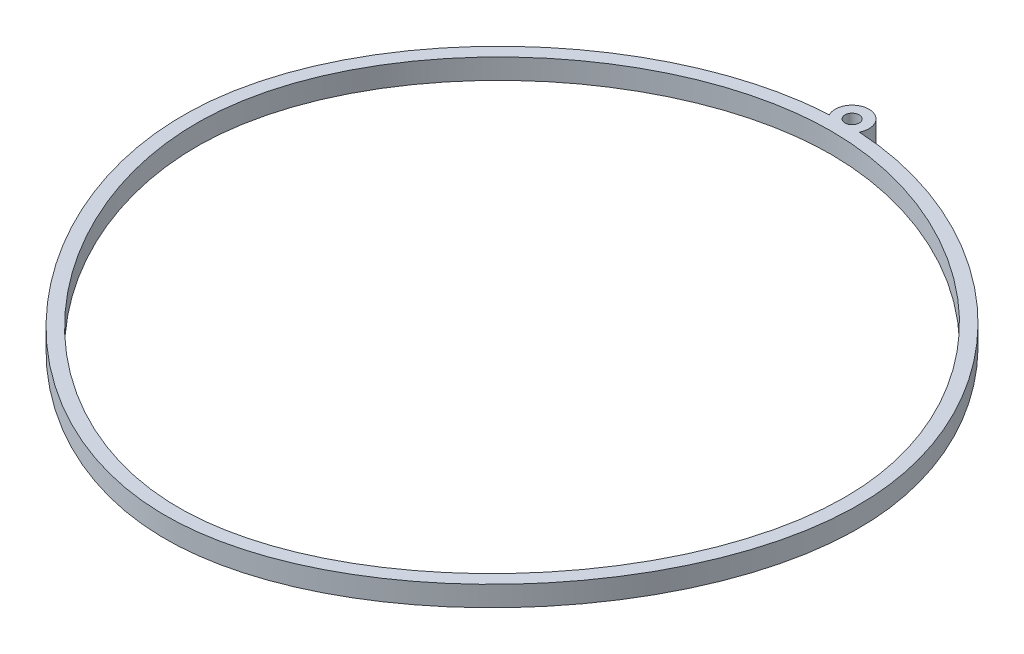
ISO-10303-21;
HEADER;
FILE_DESCRIPTION(('STEP AP214'),'2;1');
FILE_NAME('part.step','',(''),(''),'','','');
FILE_SCHEMA(('AUTOMOTIVE_DESIGN { 1 0 10303 214 1 1 1 1 }'));
ENDSEC;
DATA;
#1=APPLICATION_CONTEXT('core data for automotive mechanical design processes');
#2=APPLICATION_PROTOCOL_DEFINITION('international standard','automotive_design',2000,#1);
#3=PRODUCT_CONTEXT('',#1,'mechanical');
#4=PRODUCT('Part','Part','',(#3));
#5=PRODUCT_RELATED_PRODUCT_CATEGORY('part','',(#4));
#6=PRODUCT_DEFINITION_FORMATION('','',#4);
#7=PRODUCT_DEFINITION_CONTEXT('part definition',#1,'design');
#8=PRODUCT_DEFINITION('design','',#6,#7);
#9=PRODUCT_DEFINITION_SHAPE('','',#8);
#10=(LENGTH_UNIT() NAMED_UNIT(*) SI_UNIT(.MILLI.,.METRE.));
#11=(NAMED_UNIT(*) PLANE_ANGLE_UNIT() SI_UNIT($,.RADIAN.));
#12=(NAMED_UNIT(*) SI_UNIT($,.STERADIAN.) SOLID_ANGLE_UNIT());
#13=UNCERTAINTY_MEASURE_WITH_UNIT(LENGTH_MEASURE(1.E-05),#10,'distance_accuracy_value','');
#14=(GEOMETRIC_REPRESENTATION_CONTEXT(3) GLOBAL_UNCERTAINTY_ASSIGNED_CONTEXT((#13)) GLOBAL_UNIT_ASSIGNED_CONTEXT((#10,
#11,#12)) REPRESENTATION_CONTEXT('',''));
#15=CARTESIAN_POINT('',(0.,0.,0.));
#16=DIRECTION('',(0.,0.,1.));
#17=DIRECTION('',(1.,0.,0.));
#18=AXIS2_PLACEMENT_3D('',#15,#16,#17);
#19=CARTESIAN_POINT('',(0.,3.,-46.5304));
#20=DIRECTION('',(0.,-1.,0.));
#21=DIRECTION('',(0.,0.,-1.));
#22=AXIS2_PLACEMENT_3D('',#19,#20,#21);
#23=CYLINDRICAL_SURFACE('',#22,2.50000000000002);
#24=CARTESIAN_POINT('',(0.,0.,-46.5304));
#25=DIRECTION('',(0.,1.,0.));
#26=DIRECTION('',(0.,0.,1.));
#27=AXIS2_PLACEMENT_3D('',#24,#25,#26);
#28=CIRCLE('',#27,2.50000000000002);
#29=CARTESIAN_POINT('',(2.21457080166397,0.,-45.3703671709742));
#30=VERTEX_POINT('',#29);
#31=CARTESIAN_POINT('',(-2.21457080166396,0.,-45.3703671709742));
#32=VERTEX_POINT('',#31);
#33=EDGE_CURVE('E64',#30,#32,#28,.T.);
#34=ORIENTED_EDGE('',*,*,#33,.T.);
#35=DIRECTION('',(0.,-1.,0.));
#36=VECTOR('',#35,1.);
#37=CARTESIAN_POINT('',(-2.21457080166396,3.,-45.3703671709742));
#38=LINE('',#37,#36);
#39=CARTESIAN_POINT('',(-2.21457080166396,3.,-45.3703671709742));
#40=VERTEX_POINT('',#39);
#41=EDGE_CURVE('E11',#40,#32,#38,.T.);
#42=ORIENTED_EDGE('',*,*,#41,.F.);
#43=CARTESIAN_POINT('',(0.,3.,-46.5304));
#44=DIRECTION('',(0.,1.,0.));
#45=DIRECTION('',(0.,0.,1.));
#46=AXIS2_PLACEMENT_3D('',#43,#44,#45);
#47=CIRCLE('',#46,2.50000000000002);
#48=CARTESIAN_POINT('',(2.21457080166397,3.,-45.3703671709742));
#49=VERTEX_POINT('',#48);
#50=EDGE_CURVE('E66',#49,#40,#47,.T.);
#51=ORIENTED_EDGE('',*,*,#50,.F.);
#52=DIRECTION('',(0.,-1.,0.));
#53=VECTOR('',#52,1.);
#54=CARTESIAN_POINT('',(2.21457080166397,3.,-45.3703671709742));
#55=LINE('',#54,#53);
#56=EDGE_CURVE('E48',#49,#30,#55,.T.);
#57=ORIENTED_EDGE('',*,*,#56,.T.);
#58=EDGE_LOOP('',(#34,#42,#51,#57));
#59=FACE_BOUND('',#58,.T.);
#60=ADVANCED_FACE('F39',(#59),#23,.T.);
#61=CARTESIAN_POINT('',(0.,3.,-45.4304));
#62=CARTESIAN_POINT('',(24.1630686267008,3.,-45.4304));
#63=CARTESIAN_POINT('',(74.9408233980818,3.,0.0160415094266469));
#64=CARTESIAN_POINT('',(0.,3.,83.943698436738));
#65=CARTESIAN_POINT('',(-74.9408233980818,3.,0.0160415094266282));
#66=CARTESIAN_POINT('',(-24.1630686267008,3.,-45.4304));
#67=CARTESIAN_POINT('',(0.,3.,-45.4304));
#68=B_SPLINE_CURVE_WITH_KNOTS('',3,(#61,#62,#63,#64,#65,#66,#67),.UNSPECIFIED.,.T.,.F.,(4,1,1,1,
4),(0.,0.237929667582697,0.5,0.762070332417303,1.),.UNSPECIFIED.);
#69=DIRECTION('',(0.,-1.,0.));
#70=VECTOR('',#69,1.);
#71=SURFACE_OF_LINEAR_EXTRUSION('',#68,#70);
#72=CARTESIAN_POINT('',(0.,0.,-45.4304));
#73=CARTESIAN_POINT('',(24.1630686267008,0.,-45.4304));
#74=CARTESIAN_POINT('',(74.9408233980818,0.,0.0160415094266469));
#75=CARTESIAN_POINT('',(0.,0.,83.943698436738));
#76=CARTESIAN_POINT('',(-74.9408233980818,0.,0.0160415094266282));
#77=CARTESIAN_POINT('',(-24.1630686267008,0.,-45.4304));
#78=CARTESIAN_POINT('',(0.,0.,-45.4304));
#79=B_SPLINE_CURVE_WITH_KNOTS('',3,(#72,#73,#74,#75,#76,#77,#78),.UNSPECIFIED.,.T.,.F.,(4,1,1,1,
4),(0.,0.237929667582697,0.5,0.762070332417303,1.),.UNSPECIFIED.);
#80=EDGE_CURVE('E72',#30,#32,#79,.T.);
#81=ORIENTED_EDGE('',*,*,#80,.F.);
#82=ORIENTED_EDGE('',*,*,#56,.F.);
#83=EDGE_CURVE('E99',#49,#40,#68,.T.);
#84=ORIENTED_EDGE('',*,*,#83,.T.);
#85=ORIENTED_EDGE('',*,*,#41,.T.);
#86=EDGE_LOOP('',(#81,#82,#84,#85));
#87=FACE_BOUND('',#86,.T.);
#88=ADVANCED_FACE('F75',(#87),#71,.T.);
#89=CARTESIAN_POINT('',(0.,3.,-46.5304));
#90=DIRECTION('',(0.,-1.,0.));
#91=DIRECTION('',(0.,0.,-1.));
#92=AXIS2_PLACEMENT_3D('',#89,#90,#91);
#93=CYLINDRICAL_SURFACE('',#92,1.05);
#94=CARTESIAN_POINT('',(0.,3.,-46.5304));
#95=DIRECTION('',(0.,1.,0.));
#96=DIRECTION('',(0.,0.,1.));
#97=AXIS2_PLACEMENT_3D('',#94,#95,#96);
#98=CIRCLE('',#97,1.05);
#99=CARTESIAN_POINT('',(0.,3.,-45.4804));
#100=VERTEX_POINT('',#99);
#101=EDGE_CURVE('E79',#100,#100,#98,.T.);
#102=ORIENTED_EDGE('',*,*,#101,.T.);
#103=EDGE_LOOP('',(#102));
#104=FACE_BOUND('',#103,.T.);
#105=CARTESIAN_POINT('',(0.,0.,-46.5304));
#106=DIRECTION('',(0.,1.,0.));
#107=DIRECTION('',(0.,0.,1.));
#108=AXIS2_PLACEMENT_3D('',#105,#106,#107);
#109=CIRCLE('',#108,1.05);
#110=CARTESIAN_POINT('',(0.,0.,-45.4804));
#111=VERTEX_POINT('',#110);
#112=EDGE_CURVE('E73',#111,#111,#109,.T.);
#113=ORIENTED_EDGE('',*,*,#112,.F.);
#114=EDGE_LOOP('',(#113));
#115=FACE_BOUND('',#114,.T.);
#116=ADVANCED_FACE('F41',(#104,#115),#93,.F.);
#117=CARTESIAN_POINT('',(0.,3.,-43.4304));
#118=CARTESIAN_POINT('',(23.1646832383161,3.,-43.4304));
#119=CARTESIAN_POINT('',(71.9472825128052,3.,0.0157370829162647));
#120=CARTESIAN_POINT('',(0.,3.,80.948848584842));
#121=CARTESIAN_POINT('',(-71.9472825128052,3.,0.0157370829162921));
#122=CARTESIAN_POINT('',(-23.1646832383161,3.,-43.4304));
#123=CARTESIAN_POINT('',(0.,3.,-43.4304));
#124=B_SPLINE_CURVE_WITH_KNOTS('',3,(#117,#118,#119,#120,#121,#122,#123),.UNSPECIFIED.,.T.,.F.,
(4,1,1,1,4),(0.,0.237427726103455,0.5,0.762572273896545,1.),.UNSPECIFIED.);
#125=DIRECTION('',(0.,-1.,0.));
#126=VECTOR('',#125,1.);
#127=SURFACE_OF_LINEAR_EXTRUSION('',#124,#126);
#128=CARTESIAN_POINT('',(0.,3.,-43.4304));
#129=VERTEX_POINT('',#128);
#130=EDGE_CURVE('E68',#129,#129,#124,.T.);
#131=ORIENTED_EDGE('',*,*,#130,.F.);
#132=EDGE_LOOP('',(#131));
#133=FACE_BOUND('',#132,.T.);
#134=CARTESIAN_POINT('',(0.,0.,-43.4304));
#135=CARTESIAN_POINT('',(23.1646832383161,0.,-43.4304));
#136=CARTESIAN_POINT('',(71.9472825128052,0.,0.0157370829162647));
#137=CARTESIAN_POINT('',(0.,0.,80.948848584842));
#138=CARTESIAN_POINT('',(-71.9472825128052,0.,0.0157370829162921));
#139=CARTESIAN_POINT('',(-23.1646832383161,0.,-43.4304));
#140=CARTESIAN_POINT('',(0.,0.,-43.4304));
#141=B_SPLINE_CURVE_WITH_KNOTS('',3,(#134,#135,#136,#137,#138,#139,#140),.UNSPECIFIED.,.T.,.F.,
(4,1,1,1,4),(0.,0.237427726103455,0.5,0.762572273896545,1.),.UNSPECIFIED.);
#142=CARTESIAN_POINT('',(0.,0.,-43.4304));
#143=VERTEX_POINT('',#142);
#144=EDGE_CURVE('E76',#143,#143,#141,.T.);
#145=ORIENTED_EDGE('',*,*,#144,.T.);
#146=EDGE_LOOP('',(#145));
#147=FACE_BOUND('',#146,.T.);
#148=ADVANCED_FACE('F108',(#133,#147),#127,.F.);
#149=CARTESIAN_POINT('',(0.,3.,0.));
#150=DIRECTION('',(0.,1.,0.));
#151=DIRECTION('',(0.,0.,1.));
#152=AXIS2_PLACEMENT_3D('',#149,#150,#151);
#153=PLANE('',#152);
#154=ORIENTED_EDGE('',*,*,#101,.F.);
#155=EDGE_LOOP('',(#154));
#156=FACE_BOUND('',#155,.T.);
#157=ORIENTED_EDGE('',*,*,#50,.T.);
#158=ORIENTED_EDGE('',*,*,#83,.F.);
#159=EDGE_LOOP('',(#157,#158));
#160=FACE_BOUND('',#159,.T.);
#161=ORIENTED_EDGE('',*,*,#130,.T.);
#162=EDGE_LOOP('',(#161));
#163=FACE_BOUND('',#162,.T.);
#164=ADVANCED_FACE('F112',(#156,#160,#163),#153,.T.);
#165=CARTESIAN_POINT('',(0.,0.,0.));
#166=DIRECTION('',(0.,1.,0.));
#167=DIRECTION('',(0.,0.,1.));
#168=AXIS2_PLACEMENT_3D('',#165,#166,#167);
#169=PLANE('',#168);
#170=ORIENTED_EDGE('',*,*,#112,.T.);
#171=EDGE_LOOP('',(#170));
#172=FACE_BOUND('',#171,.T.);
#173=ORIENTED_EDGE('',*,*,#33,.F.);
#174=ORIENTED_EDGE('',*,*,#80,.T.);
#175=EDGE_LOOP('',(#173,#174));
#176=FACE_BOUND('',#175,.T.);
#177=ORIENTED_EDGE('',*,*,#144,.F.);
#178=EDGE_LOOP('',(#177));
#179=FACE_BOUND('',#178,.T.);
#180=ADVANCED_FACE('F70',(#172,#176,#179),#169,.F.);
#181=CLOSED_SHELL('',(#60,#88,#116,#148,#164,#180));
#182=MANIFOLD_SOLID_BREP('B2',#181);
#183=ADVANCED_BREP_SHAPE_REPRESENTATION('',(#18,#182),#14);
#184=SHAPE_DEFINITION_REPRESENTATION(#9,#183);
ENDSEC;
END-ISO-10303-21;
